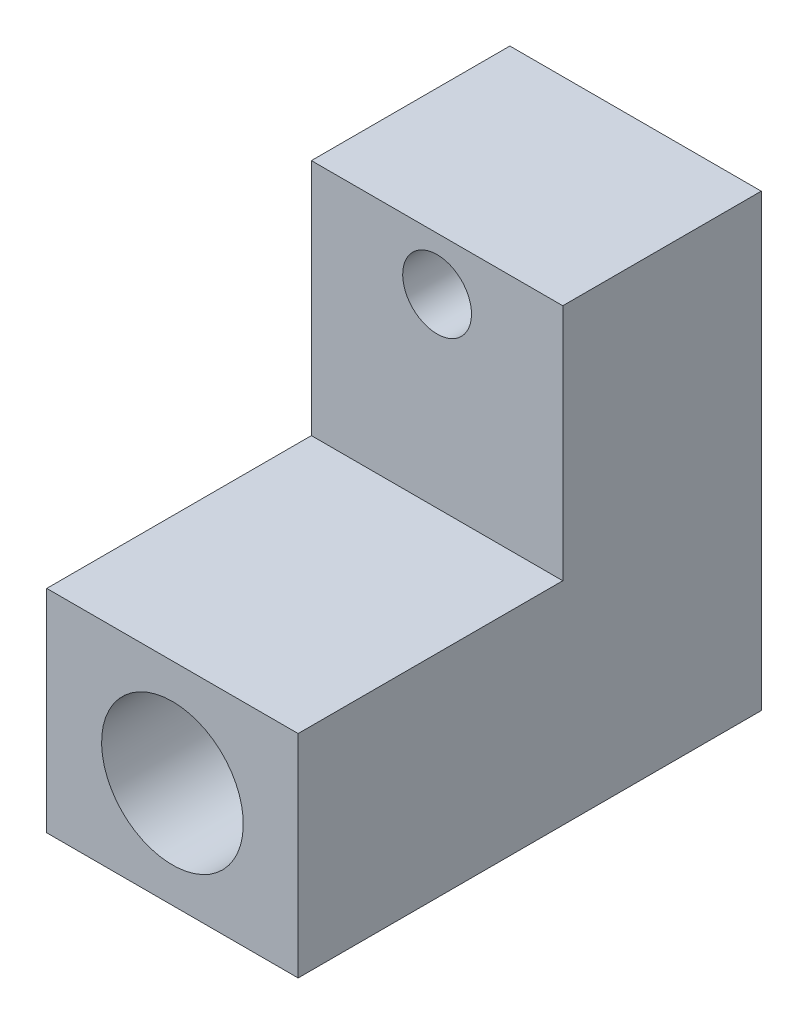
ISO-10303-21;
HEADER;
FILE_DESCRIPTION(('STEP AP214'),'2;1');
FILE_NAME('part.step','',(''),(''),'','','');
FILE_SCHEMA(('AUTOMOTIVE_DESIGN { 1 0 10303 214 1 1 1 1 }'));
ENDSEC;
DATA;
#1=APPLICATION_CONTEXT('core data for automotive mechanical design processes');
#2=APPLICATION_PROTOCOL_DEFINITION('international standard','automotive_design',2000,#1);
#3=PRODUCT_CONTEXT('',#1,'mechanical');
#4=PRODUCT('Part','Part','',(#3));
#5=PRODUCT_RELATED_PRODUCT_CATEGORY('part','',(#4));
#6=PRODUCT_DEFINITION_FORMATION('','',#4);
#7=PRODUCT_DEFINITION_CONTEXT('part definition',#1,'design');
#8=PRODUCT_DEFINITION('design','',#6,#7);
#9=PRODUCT_DEFINITION_SHAPE('','',#8);
#10=(LENGTH_UNIT() NAMED_UNIT(*) SI_UNIT(.MILLI.,.METRE.));
#11=(NAMED_UNIT(*) PLANE_ANGLE_UNIT() SI_UNIT($,.RADIAN.));
#12=(NAMED_UNIT(*) SI_UNIT($,.STERADIAN.) SOLID_ANGLE_UNIT());
#13=UNCERTAINTY_MEASURE_WITH_UNIT(LENGTH_MEASURE(1.E-05),#10,'distance_accuracy_value','');
#14=(GEOMETRIC_REPRESENTATION_CONTEXT(3) GLOBAL_UNCERTAINTY_ASSIGNED_CONTEXT((#13)) GLOBAL_UNIT_ASSIGNED_CONTEXT((#10,
#11,#12)) REPRESENTATION_CONTEXT('',''));
#15=CARTESIAN_POINT('',(0.,0.,0.));
#16=DIRECTION('',(0.,0.,1.));
#17=DIRECTION('',(1.,0.,0.));
#18=AXIS2_PLACEMENT_3D('',#15,#16,#17);
#19=CARTESIAN_POINT('',(-12.065,0.,-22.225));
#20=DIRECTION('',(0.,-1.,0.));
#21=DIRECTION('',(0.,0.,-1.));
#22=AXIS2_PLACEMENT_3D('',#19,#20,#21);
#23=PLANE('',#22);
#24=DIRECTION('',(0.,0.,-1.));
#25=VECTOR('',#24,1.);
#26=CARTESIAN_POINT('',(0.,0.,-22.225));
#27=LINE('',#26,#25);
#28=CARTESIAN_POINT('',(0.,0.,0.));
#29=VERTEX_POINT('',#28);
#30=CARTESIAN_POINT('',(0.,0.,-22.225));
#31=VERTEX_POINT('',#30);
#32=EDGE_CURVE('E118',#29,#31,#27,.T.);
#33=ORIENTED_EDGE('',*,*,#32,.F.);
#34=DIRECTION('',(1.,0.,0.));
#35=VECTOR('',#34,1.);
#36=CARTESIAN_POINT('',(-12.065,0.,0.));
#37=LINE('',#36,#35);
#38=CARTESIAN_POINT('',(-12.065,0.,0.));
#39=VERTEX_POINT('',#38);
#40=EDGE_CURVE('E11',#39,#29,#37,.T.);
#41=ORIENTED_EDGE('',*,*,#40,.F.);
#42=DIRECTION('',(0.,0.,-1.));
#43=VECTOR('',#42,1.);
#44=CARTESIAN_POINT('',(-12.065,0.,-22.225));
#45=LINE('',#44,#43);
#46=CARTESIAN_POINT('',(-12.065,0.,-22.225));
#47=VERTEX_POINT('',#46);
#48=EDGE_CURVE('E133',#39,#47,#45,.T.);
#49=ORIENTED_EDGE('',*,*,#48,.T.);
#50=DIRECTION('',(1.,0.,0.));
#51=VECTOR('',#50,1.);
#52=CARTESIAN_POINT('',(-12.065,0.,-22.225));
#53=LINE('',#52,#51);
#54=EDGE_CURVE('E36',#47,#31,#53,.T.);
#55=ORIENTED_EDGE('',*,*,#54,.T.);
#56=EDGE_LOOP('',(#33,#41,#49,#55));
#57=FACE_BOUND('',#56,.T.);
#58=ADVANCED_FACE('F33',(#57),#23,.T.);
#59=CARTESIAN_POINT('',(-12.065,0.,0.));
#60=DIRECTION('',(0.,0.,1.));
#61=DIRECTION('',(1.,0.,0.));
#62=AXIS2_PLACEMENT_3D('',#59,#60,#61);
#63=PLANE('',#62);
#64=CARTESIAN_POINT('',(-6.0325,5.07999999999998,0.));
#65=DIRECTION('',(0.,0.,-1.));
#66=DIRECTION('',(0.,1.,0.));
#67=AXIS2_PLACEMENT_3D('',#64,#65,#66);
#68=CIRCLE('',#67,3.39999999999999);
#69=CARTESIAN_POINT('',(-6.0325,8.47999999999997,0.));
#70=VERTEX_POINT('',#69);
#71=EDGE_CURVE('E122',#70,#70,#68,.T.);
#72=ORIENTED_EDGE('',*,*,#71,.T.);
#73=EDGE_LOOP('',(#72));
#74=FACE_BOUND('',#73,.T.);
#75=DIRECTION('',(0.,-1.,0.));
#76=VECTOR('',#75,1.);
#77=CARTESIAN_POINT('',(0.,0.,0.));
#78=LINE('',#77,#76);
#79=CARTESIAN_POINT('',(0.,10.16,0.));
#80=VERTEX_POINT('',#79);
#81=EDGE_CURVE('E131',#80,#29,#78,.T.);
#82=ORIENTED_EDGE('',*,*,#81,.F.);
#83=DIRECTION('',(1.,0.,0.));
#84=VECTOR('',#83,1.);
#85=CARTESIAN_POINT('',(-12.065,10.16,0.));
#86=LINE('',#85,#84);
#87=CARTESIAN_POINT('',(-12.065,10.16,0.));
#88=VERTEX_POINT('',#87);
#89=EDGE_CURVE('E42',#88,#80,#86,.T.);
#90=ORIENTED_EDGE('',*,*,#89,.F.);
#91=DIRECTION('',(0.,-1.,0.));
#92=VECTOR('',#91,1.);
#93=CARTESIAN_POINT('',(-12.065,0.,0.));
#94=LINE('',#93,#92);
#95=EDGE_CURVE('E108',#88,#39,#94,.T.);
#96=ORIENTED_EDGE('',*,*,#95,.T.);
#97=ORIENTED_EDGE('',*,*,#40,.T.);
#98=EDGE_LOOP('',(#82,#90,#96,#97));
#99=FACE_BOUND('',#98,.T.);
#100=ADVANCED_FACE('F141',(#74,#99),#63,.T.);
#101=CARTESIAN_POINT('',(-12.065,10.16,0.));
#102=DIRECTION('',(0.,1.,0.));
#103=DIRECTION('',(0.,0.,1.));
#104=AXIS2_PLACEMENT_3D('',#101,#102,#103);
#105=PLANE('',#104);
#106=DIRECTION('',(0.,0.,1.));
#107=VECTOR('',#106,1.);
#108=CARTESIAN_POINT('',(0.,10.16,0.));
#109=LINE('',#108,#107);
#110=CARTESIAN_POINT('',(0.,10.16,-12.7));
#111=VERTEX_POINT('',#110);
#112=EDGE_CURVE('E95',#111,#80,#109,.T.);
#113=ORIENTED_EDGE('',*,*,#112,.F.);
#114=DIRECTION('',(1.,0.,0.));
#115=VECTOR('',#114,1.);
#116=CARTESIAN_POINT('',(-12.065,10.16,-12.7));
#117=LINE('',#116,#115);
#118=CARTESIAN_POINT('',(-12.065,10.16,-12.7));
#119=VERTEX_POINT('',#118);
#120=EDGE_CURVE('E90',#119,#111,#117,.T.);
#121=ORIENTED_EDGE('',*,*,#120,.F.);
#122=DIRECTION('',(0.,0.,1.));
#123=VECTOR('',#122,1.);
#124=CARTESIAN_POINT('',(-12.065,10.16,0.));
#125=LINE('',#124,#123);
#126=EDGE_CURVE('E93',#119,#88,#125,.T.);
#127=ORIENTED_EDGE('',*,*,#126,.T.);
#128=ORIENTED_EDGE('',*,*,#89,.T.);
#129=EDGE_LOOP('',(#113,#121,#127,#128));
#130=FACE_BOUND('',#129,.T.);
#131=ADVANCED_FACE('F92',(#130),#105,.T.);
#132=CARTESIAN_POINT('',(-12.065,10.16,-12.7));
#133=DIRECTION('',(0.,0.,1.));
#134=DIRECTION('',(1.,0.,0.));
#135=AXIS2_PLACEMENT_3D('',#132,#133,#134);
#136=PLANE('',#135);
#137=CARTESIAN_POINT('',(-6.0325,19.05,-12.7));
#138=DIRECTION('',(0.,0.,1.));
#139=DIRECTION('',(1.,0.,0.));
#140=AXIS2_PLACEMENT_3D('',#137,#138,#139);
#141=CIRCLE('',#140,1.651);
#142=CARTESIAN_POINT('',(-6.0325,20.701,-12.7));
#143=VERTEX_POINT('',#142);
#144=EDGE_CURVE('E173',#143,#143,#141,.T.);
#145=ORIENTED_EDGE('',*,*,#144,.F.);
#146=EDGE_LOOP('',(#145));
#147=FACE_BOUND('',#146,.T.);
#148=DIRECTION('',(0.,-1.,0.));
#149=VECTOR('',#148,1.);
#150=CARTESIAN_POINT('',(0.,10.16,-12.7));
#151=LINE('',#150,#149);
#152=CARTESIAN_POINT('',(0.,21.59,-12.7));
#153=VERTEX_POINT('',#152);
#154=EDGE_CURVE('E128',#153,#111,#151,.T.);
#155=ORIENTED_EDGE('',*,*,#154,.F.);
#156=DIRECTION('',(1.,0.,0.));
#157=VECTOR('',#156,1.);
#158=CARTESIAN_POINT('',(-12.065,21.59,-12.7));
#159=LINE('',#158,#157);
#160=CARTESIAN_POINT('',(-12.065,21.59,-12.7));
#161=VERTEX_POINT('',#160);
#162=EDGE_CURVE('E100',#161,#153,#159,.T.);
#163=ORIENTED_EDGE('',*,*,#162,.F.);
#164=DIRECTION('',(0.,-1.,0.));
#165=VECTOR('',#164,1.);
#166=CARTESIAN_POINT('',(-12.065,10.16,-12.7));
#167=LINE('',#166,#165);
#168=EDGE_CURVE('E106',#161,#119,#167,.T.);
#169=ORIENTED_EDGE('',*,*,#168,.T.);
#170=ORIENTED_EDGE('',*,*,#120,.T.);
#171=EDGE_LOOP('',(#155,#163,#169,#170));
#172=FACE_BOUND('',#171,.T.);
#173=ADVANCED_FACE('F110',(#147,#172),#136,.T.);
#174=CARTESIAN_POINT('',(-12.065,21.59,-12.7));
#175=DIRECTION('',(0.,1.,0.));
#176=DIRECTION('',(0.,0.,1.));
#177=AXIS2_PLACEMENT_3D('',#174,#175,#176);
#178=PLANE('',#177);
#179=DIRECTION('',(0.,0.,1.));
#180=VECTOR('',#179,1.);
#181=CARTESIAN_POINT('',(0.,21.59,-12.7));
#182=LINE('',#181,#180);
#183=CARTESIAN_POINT('',(0.,21.59,-22.225));
#184=VERTEX_POINT('',#183);
#185=EDGE_CURVE('E125',#184,#153,#182,.T.);
#186=ORIENTED_EDGE('',*,*,#185,.F.);
#187=DIRECTION('',(1.,0.,0.));
#188=VECTOR('',#187,1.);
#189=CARTESIAN_POINT('',(-12.065,21.59,-22.225));
#190=LINE('',#189,#188);
#191=CARTESIAN_POINT('',(-12.065,21.59,-22.225));
#192=VERTEX_POINT('',#191);
#193=EDGE_CURVE('E136',#192,#184,#190,.T.);
#194=ORIENTED_EDGE('',*,*,#193,.F.);
#195=DIRECTION('',(0.,0.,1.));
#196=VECTOR('',#195,1.);
#197=CARTESIAN_POINT('',(-12.065,21.59,-12.7));
#198=LINE('',#197,#196);
#199=EDGE_CURVE('E111',#192,#161,#198,.T.);
#200=ORIENTED_EDGE('',*,*,#199,.T.);
#201=ORIENTED_EDGE('',*,*,#162,.T.);
#202=EDGE_LOOP('',(#186,#194,#200,#201));
#203=FACE_BOUND('',#202,.T.);
#204=ADVANCED_FACE('F156',(#203),#178,.T.);
#205=CARTESIAN_POINT('',(-12.065,21.59,-22.225));
#206=DIRECTION('',(0.,0.,-1.));
#207=DIRECTION('',(0.,1.,0.));
#208=AXIS2_PLACEMENT_3D('',#205,#206,#207);
#209=PLANE('',#208);
#210=CARTESIAN_POINT('',(-6.0325,19.05,-22.225));
#211=DIRECTION('',(0.,0.,-1.));
#212=DIRECTION('',(0.,1.,0.));
#213=AXIS2_PLACEMENT_3D('',#210,#211,#212);
#214=CIRCLE('',#213,1.651);
#215=CARTESIAN_POINT('',(-6.0325,20.701,-22.225));
#216=VERTEX_POINT('',#215);
#217=EDGE_CURVE('E168',#216,#216,#214,.T.);
#218=ORIENTED_EDGE('',*,*,#217,.F.);
#219=EDGE_LOOP('',(#218));
#220=FACE_BOUND('',#219,.T.);
#221=CARTESIAN_POINT('',(-6.0325,5.07999999999999,-22.225));
#222=DIRECTION('',(0.,0.,-1.));
#223=DIRECTION('',(0.,1.,0.));
#224=AXIS2_PLACEMENT_3D('',#221,#222,#223);
#225=CIRCLE('',#224,3.39999999999999);
#226=CARTESIAN_POINT('',(-6.0325,8.47999999999998,-22.225));
#227=VERTEX_POINT('',#226);
#228=EDGE_CURVE('E171',#227,#227,#225,.T.);
#229=ORIENTED_EDGE('',*,*,#228,.F.);
#230=EDGE_LOOP('',(#229));
#231=FACE_BOUND('',#230,.T.);
#232=DIRECTION('',(0.,1.,0.));
#233=VECTOR('',#232,1.);
#234=CARTESIAN_POINT('',(0.,21.59,-22.225));
#235=LINE('',#234,#233);
#236=EDGE_CURVE('E121',#31,#184,#235,.T.);
#237=ORIENTED_EDGE('',*,*,#236,.F.);
#238=ORIENTED_EDGE('',*,*,#54,.F.);
#239=DIRECTION('',(0.,1.,0.));
#240=VECTOR('',#239,1.);
#241=CARTESIAN_POINT('',(-12.065,21.59,-22.225));
#242=LINE('',#241,#240);
#243=EDGE_CURVE('E113',#47,#192,#242,.T.);
#244=ORIENTED_EDGE('',*,*,#243,.T.);
#245=ORIENTED_EDGE('',*,*,#193,.T.);
#246=EDGE_LOOP('',(#237,#238,#244,#245));
#247=FACE_BOUND('',#246,.T.);
#248=ADVANCED_FACE('F138',(#220,#231,#247),#209,.T.);
#249=CARTESIAN_POINT('',(-12.065,0.,0.));
#250=DIRECTION('',(-1.,0.,0.));
#251=DIRECTION('',(0.,0.,1.));
#252=AXIS2_PLACEMENT_3D('',#249,#250,#251);
#253=PLANE('',#252);
#254=ORIENTED_EDGE('',*,*,#48,.F.);
#255=ORIENTED_EDGE('',*,*,#95,.F.);
#256=ORIENTED_EDGE('',*,*,#126,.F.);
#257=ORIENTED_EDGE('',*,*,#168,.F.);
#258=ORIENTED_EDGE('',*,*,#199,.F.);
#259=ORIENTED_EDGE('',*,*,#243,.F.);
#260=EDGE_LOOP('',(#254,#255,#256,#257,#258,#259));
#261=FACE_BOUND('',#260,.T.);
#262=ADVANCED_FACE('F104',(#261),#253,.T.);
#263=CARTESIAN_POINT('',(0.,0.,0.));
#264=DIRECTION('',(-1.,0.,0.));
#265=DIRECTION('',(0.,0.,1.));
#266=AXIS2_PLACEMENT_3D('',#263,#264,#265);
#267=PLANE('',#266);
#268=ORIENTED_EDGE('',*,*,#32,.T.);
#269=ORIENTED_EDGE('',*,*,#236,.T.);
#270=ORIENTED_EDGE('',*,*,#185,.T.);
#271=ORIENTED_EDGE('',*,*,#154,.T.);
#272=ORIENTED_EDGE('',*,*,#112,.T.);
#273=ORIENTED_EDGE('',*,*,#81,.T.);
#274=EDGE_LOOP('',(#268,#269,#270,#271,#272,#273));
#275=FACE_BOUND('',#274,.T.);
#276=ADVANCED_FACE('F140',(#275),#267,.F.);
#277=CARTESIAN_POINT('',(-6.0325,5.07999999999999,-22.225));
#278=DIRECTION('',(0.,0.,-1.));
#279=DIRECTION('',(0.,1.,0.));
#280=AXIS2_PLACEMENT_3D('',#277,#278,#279);
#281=CYLINDRICAL_SURFACE('',#280,3.39999999999999);
#282=ORIENTED_EDGE('',*,*,#71,.F.);
#283=EDGE_LOOP('',(#282));
#284=FACE_BOUND('',#283,.T.);
#285=ORIENTED_EDGE('',*,*,#228,.T.);
#286=EDGE_LOOP('',(#285));
#287=FACE_BOUND('',#286,.T.);
#288=ADVANCED_FACE('F183',(#284,#287),#281,.F.);
#289=CARTESIAN_POINT('',(-6.0325,19.05,0.));
#290=DIRECTION('',(0.,0.,-1.));
#291=DIRECTION('',(0.,1.,0.));
#292=AXIS2_PLACEMENT_3D('',#289,#290,#291);
#293=CYLINDRICAL_SURFACE('',#292,1.651);
#294=CARTESIAN_POINT('',(-6.0325,20.701,-12.7));
#295=CARTESIAN_POINT('',(-6.0325,20.701,-12.79921875));
#296=CARTESIAN_POINT('',(-6.0325,20.701,-12.8984375));
#297=CARTESIAN_POINT('',(-6.0325,20.701,-13.096875));
#298=CARTESIAN_POINT('',(-6.0325,20.701,-13.19609375));
#299=CARTESIAN_POINT('',(-6.0325,20.701,-13.39453125));
#300=CARTESIAN_POINT('',(-6.0325,20.701,-13.49375));
#301=CARTESIAN_POINT('',(-6.0325,20.701,-13.6921875));
#302=CARTESIAN_POINT('',(-6.0325,20.701,-13.79140625));
#303=CARTESIAN_POINT('',(-6.0325,20.701,-13.98984375));
#304=CARTESIAN_POINT('',(-6.0325,20.701,-14.0890625));
#305=CARTESIAN_POINT('',(-6.0325,20.701,-14.2875));
#306=CARTESIAN_POINT('',(-6.0325,20.701,-14.38671875));
#307=CARTESIAN_POINT('',(-6.0325,20.701,-14.58515625));
#308=CARTESIAN_POINT('',(-6.0325,20.701,-14.684375));
#309=CARTESIAN_POINT('',(-6.0325,20.701,-14.8828125));
#310=CARTESIAN_POINT('',(-6.0325,20.701,-14.98203125));
#311=CARTESIAN_POINT('',(-6.0325,20.701,-15.18046875));
#312=CARTESIAN_POINT('',(-6.0325,20.701,-15.2796875));
#313=CARTESIAN_POINT('',(-6.0325,20.701,-15.478125));
#314=CARTESIAN_POINT('',(-6.0325,20.701,-15.57734375));
#315=CARTESIAN_POINT('',(-6.0325,20.701,-15.77578125));
#316=CARTESIAN_POINT('',(-6.0325,20.701,-15.875));
#317=CARTESIAN_POINT('',(-6.0325,20.701,-16.0734375));
#318=CARTESIAN_POINT('',(-6.0325,20.701,-16.17265625));
#319=CARTESIAN_POINT('',(-6.0325,20.701,-16.37109375));
#320=CARTESIAN_POINT('',(-6.0325,20.701,-16.4703125));
#321=CARTESIAN_POINT('',(-6.0325,20.701,-16.66875));
#322=CARTESIAN_POINT('',(-6.0325,20.701,-16.76796875));
#323=CARTESIAN_POINT('',(-6.0325,20.701,-16.96640625));
#324=CARTESIAN_POINT('',(-6.0325,20.701,-17.065625));
#325=CARTESIAN_POINT('',(-6.0325,20.701,-17.2640625));
#326=CARTESIAN_POINT('',(-6.0325,20.701,-17.36328125));
#327=CARTESIAN_POINT('',(-6.0325,20.701,-17.56171875));
#328=CARTESIAN_POINT('',(-6.0325,20.701,-17.6609375));
#329=CARTESIAN_POINT('',(-6.0325,20.701,-17.859375));
#330=CARTESIAN_POINT('',(-6.0325,20.701,-17.95859375));
#331=CARTESIAN_POINT('',(-6.0325,20.701,-18.15703125));
#332=CARTESIAN_POINT('',(-6.0325,20.701,-18.25625));
#333=CARTESIAN_POINT('',(-6.0325,20.701,-18.4546875));
#334=CARTESIAN_POINT('',(-6.0325,20.701,-18.55390625));
#335=CARTESIAN_POINT('',(-6.0325,20.701,-18.75234375));
#336=CARTESIAN_POINT('',(-6.0325,20.701,-18.8515625));
#337=CARTESIAN_POINT('',(-6.0325,20.701,-19.05));
#338=CARTESIAN_POINT('',(-6.0325,20.701,-19.14921875));
#339=CARTESIAN_POINT('',(-6.0325,20.701,-19.34765625));
#340=CARTESIAN_POINT('',(-6.0325,20.701,-19.446875));
#341=CARTESIAN_POINT('',(-6.0325,20.701,-19.6453125));
#342=CARTESIAN_POINT('',(-6.0325,20.701,-19.74453125));
#343=CARTESIAN_POINT('',(-6.0325,20.701,-19.94296875));
#344=CARTESIAN_POINT('',(-6.0325,20.701,-20.0421875));
#345=CARTESIAN_POINT('',(-6.0325,20.701,-20.240625));
#346=CARTESIAN_POINT('',(-6.0325,20.701,-20.33984375));
#347=CARTESIAN_POINT('',(-6.0325,20.701,-20.53828125));
#348=CARTESIAN_POINT('',(-6.0325,20.701,-20.6375));
#349=CARTESIAN_POINT('',(-6.0325,20.701,-20.8359375));
#350=CARTESIAN_POINT('',(-6.0325,20.701,-20.93515625));
#351=CARTESIAN_POINT('',(-6.0325,20.701,-21.13359375));
#352=CARTESIAN_POINT('',(-6.0325,20.701,-21.2328125));
#353=CARTESIAN_POINT('',(-6.0325,20.701,-21.43125));
#354=CARTESIAN_POINT('',(-6.0325,20.701,-21.53046875));
#355=CARTESIAN_POINT('',(-6.0325,20.701,-21.72890625));
#356=CARTESIAN_POINT('',(-6.0325,20.701,-21.828125));
#357=CARTESIAN_POINT('',(-6.0325,20.701,-22.0265625));
#358=CARTESIAN_POINT('',(-6.0325,20.701,-22.12578125));
#359=CARTESIAN_POINT('',(-6.0325,20.701,-22.225));
#360=B_SPLINE_CURVE_WITH_KNOTS('',3,(#294,#295,#296,#297,#298,#299,#300,#301,#302,#303,#304,
#305,#306,#307,#308,#309,#310,#311,#312,#313,#314,#315,#316,#317,#318,#319,#320,#321,#322,#323,
#324,#325,#326,#327,#328,#329,#330,#331,#332,#333,#334,#335,#336,#337,#338,#339,#340,#341,#342,
#343,#344,#345,#346,#347,#348,#349,#350,#351,#352,#353,#354,#355,#356,#357,#358,#359),
.UNSPECIFIED.,.F.,.F.,(4,2,2,2,2,2,2,2,2,2,2,2,2,2,2,2,2,2,2,2,2,2,2,2,2,2,2,2,2,2,2,2,4),(0.,
0.29765625,0.5953125,0.892968750000001,1.190625,1.48828125,1.7859375,2.08359375,2.38125,
2.67890625,2.9765625,3.27421875,3.571875,3.86953125,4.1671875,4.46484375,4.7625,5.06015625,
5.3578125,5.65546875,5.953125,6.25078125,6.5484375,6.84609375,7.14375,7.44140625,7.7390625,
8.03671875,8.334375,8.63203125,8.9296875,9.22734375,9.525),.UNSPECIFIED.);
#361=EDGE_CURVE('BSEAM181',#143,#216,#360,.T.);
#362=ORIENTED_EDGE('',*,*,#144,.T.);
#363=ORIENTED_EDGE('',*,*,#217,.T.);
#364=ORIENTED_EDGE('',*,*,#361,.T.);
#365=ORIENTED_EDGE('',*,*,#361,.F.);
#366=EDGE_LOOP('',(#362,#364,#363,#365));
#367=FACE_BOUND('',#366,.T.);
#368=ADVANCED_FACE('F181',(#367),#293,.F.);
#369=CLOSED_SHELL('',(#58,#100,#131,#173,#204,#248,#262,#276,#288,#368));
#370=MANIFOLD_SOLID_BREP('B2',#369);
#371=ADVANCED_BREP_SHAPE_REPRESENTATION('',(#18,#370),#14);
#372=SHAPE_DEFINITION_REPRESENTATION(#9,#371);
ENDSEC;
END-ISO-10303-21;
